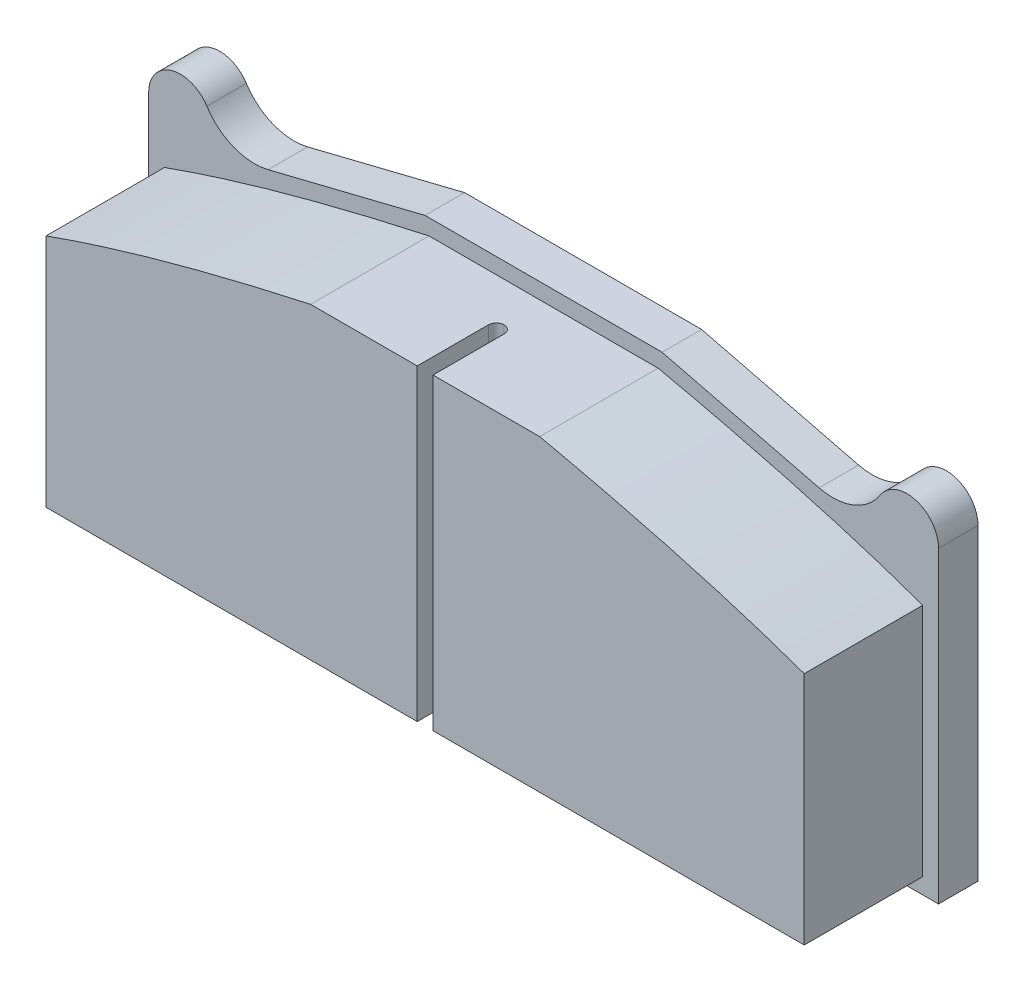
ISO-10303-21;
HEADER;
FILE_DESCRIPTION(('STEP AP214'),'2;1');
FILE_NAME('part.step','',(''),(''),'','','');
FILE_SCHEMA(('AUTOMOTIVE_DESIGN { 1 0 10303 214 1 1 1 1 }'));
ENDSEC;
DATA;
#1=APPLICATION_CONTEXT('core data for automotive mechanical design processes');
#2=APPLICATION_PROTOCOL_DEFINITION('international standard','automotive_design',2000,#1);
#3=PRODUCT_CONTEXT('',#1,'mechanical');
#4=PRODUCT('Part','Part','',(#3));
#5=PRODUCT_RELATED_PRODUCT_CATEGORY('part','',(#4));
#6=PRODUCT_DEFINITION_FORMATION('','',#4);
#7=PRODUCT_DEFINITION_CONTEXT('part definition',#1,'design');
#8=PRODUCT_DEFINITION('design','',#6,#7);
#9=PRODUCT_DEFINITION_SHAPE('','',#8);
#10=(LENGTH_UNIT() NAMED_UNIT(*) SI_UNIT(.MILLI.,.METRE.));
#11=(NAMED_UNIT(*) PLANE_ANGLE_UNIT() SI_UNIT($,.RADIAN.));
#12=(NAMED_UNIT(*) SI_UNIT($,.STERADIAN.) SOLID_ANGLE_UNIT());
#13=UNCERTAINTY_MEASURE_WITH_UNIT(LENGTH_MEASURE(1.E-05),#10,'distance_accuracy_value','');
#14=(GEOMETRIC_REPRESENTATION_CONTEXT(3) GLOBAL_UNCERTAINTY_ASSIGNED_CONTEXT((#13)) GLOBAL_UNIT_ASSIGNED_CONTEXT((#10,
#11,#12)) REPRESENTATION_CONTEXT('',''));
#15=CARTESIAN_POINT('',(0.,0.,0.));
#16=DIRECTION('',(0.,0.,1.));
#17=DIRECTION('',(1.,0.,0.));
#18=AXIS2_PLACEMENT_3D('',#15,#16,#17);
#19=CARTESIAN_POINT('',(-78.3132924028394,-13.4030324169707,20.));
#20=DIRECTION('',(0.,0.,-1.));
#21=DIRECTION('',(-1.,0.,0.));
#22=AXIS2_PLACEMENT_3D('',#19,#20,#21);
#23=PLANE('',#22);
#24=DIRECTION('',(1.,0.,0.));
#25=VECTOR('',#24,1.);
#26=CARTESIAN_POINT('',(48.,-19.5782093478457,20.));
#27=LINE('',#26,#25);
#28=CARTESIAN_POINT('',(-48.,-19.5782093478457,20.));
#29=VERTEX_POINT('',#28);
#30=CARTESIAN_POINT('',(-1.,-19.5782093478457,20.));
#31=VERTEX_POINT('',#30);
#32=EDGE_CURVE('E197',#29,#31,#27,.T.);
#33=ORIENTED_EDGE('',*,*,#32,.T.);
#34=DIRECTION('',(0.,1.,0.));
#35=VECTOR('',#34,1.);
#36=CARTESIAN_POINT('',(-1.,-13.4030324169707,20.));
#37=LINE('',#36,#35);
#38=CARTESIAN_POINT('',(-1.,19.4217906521703,20.));
#39=VERTEX_POINT('',#38);
#40=EDGE_CURVE('E205',#31,#39,#37,.T.);
#41=ORIENTED_EDGE('',*,*,#40,.T.);
#42=DIRECTION('',(-1.,0.,0.));
#43=VECTOR('',#42,1.);
#44=CARTESIAN_POINT('',(-14.5,19.4217906521543,20.));
#45=LINE('',#44,#43);
#46=CARTESIAN_POINT('',(-14.5,19.4217906521543,20.));
#47=VERTEX_POINT('',#46);
#48=EDGE_CURVE('E233',#39,#47,#45,.T.);
#49=ORIENTED_EDGE('',*,*,#48,.T.);
#50=CARTESIAN_POINT('',(995794.494761494,-90910.4584702311,20.));
#51=CARTESIAN_POINT('',(-995472.513073044,95853.1033348043,20.));
#52=CARTESIAN_POINT('',(994837.278214983,-100849.360329045,20.));
#53=B_SPLINE_CURVE_WITH_KNOTS('',2,(#50,#51,#52),.UNSPECIFIED.,.F.,.F.,(3,3),(0.,1.),.UNSPECIFIED.);
#54=CARTESIAN_POINT('',(-48.,10.1761085884526,20.));
#55=VERTEX_POINT('',#54);
#56=EDGE_CURVE('E261',#47,#55,#53,.T.);
#57=ORIENTED_EDGE('',*,*,#56,.T.);
#58=DIRECTION('',(0.,-1.,0.));
#59=VECTOR('',#58,1.);
#60=CARTESIAN_POINT('',(-48.,10.1761085884526,20.));
#61=LINE('',#60,#59);
#62=EDGE_CURVE('E215',#55,#29,#61,.T.);
#63=ORIENTED_EDGE('',*,*,#62,.T.);
#64=EDGE_LOOP('',(#33,#41,#49,#57,#63));
#65=FACE_BOUND('',#64,.T.);
#66=ADVANCED_FACE('F49',(#65),#23,.F.);
#67=DIRECTION('',(0.,0.,-1.));
#68=VECTOR('',#67,1.);
#69=SURFACE_OF_LINEAR_EXTRUSION('',#53,#68);
#70=CARTESIAN_POINT('',(995794.494761494,-90910.4584702311,5.));
#71=CARTESIAN_POINT('',(-995472.513073044,95853.1033348043,5.));
#72=CARTESIAN_POINT('',(994837.278214983,-100849.360329045,5.));
#73=B_SPLINE_CURVE_WITH_KNOTS('',2,(#70,#71,#72),.UNSPECIFIED.,.F.,.F.,(3,3),(0.,1.),.UNSPECIFIED.);
#74=CARTESIAN_POINT('',(-14.5,19.4217906521543,5.));
#75=VERTEX_POINT('',#74);
#76=CARTESIAN_POINT('',(-48.,10.1761085884526,5.));
#77=VERTEX_POINT('',#76);
#78=EDGE_CURVE('E275',#75,#77,#73,.T.);
#79=ORIENTED_EDGE('',*,*,#78,.T.);
#80=DIRECTION('',(0.,0.,-1.));
#81=VECTOR('',#80,1.);
#82=CARTESIAN_POINT('',(-48.,10.1761085884526,20.));
#83=LINE('',#82,#81);
#84=EDGE_CURVE('E212',#55,#77,#83,.T.);
#85=ORIENTED_EDGE('',*,*,#84,.F.);
#86=ORIENTED_EDGE('',*,*,#56,.F.);
#87=DIRECTION('',(0.,0.,-1.));
#88=VECTOR('',#87,1.);
#89=CARTESIAN_POINT('',(-14.5,19.4217906521543,20.));
#90=LINE('',#89,#88);
#91=EDGE_CURVE('E430',#47,#75,#90,.T.);
#92=ORIENTED_EDGE('',*,*,#91,.T.);
#93=EDGE_LOOP('',(#79,#85,#86,#92));
#94=FACE_BOUND('',#93,.T.);
#95=ADVANCED_FACE('F256',(#94),#69,.F.);
#96=CARTESIAN_POINT('',(-48.,10.1761085884526,20.));
#97=DIRECTION('',(1.,0.,0.));
#98=DIRECTION('',(0.,1.,0.));
#99=AXIS2_PLACEMENT_3D('',#96,#97,#98);
#100=PLANE('',#99);
#101=DIRECTION('',(0.,-1.,0.));
#102=VECTOR('',#101,1.);
#103=CARTESIAN_POINT('',(-48.,10.1761085884526,5.));
#104=LINE('',#103,#102);
#105=CARTESIAN_POINT('',(-48.,-19.5782093478457,5.));
#106=VERTEX_POINT('',#105);
#107=EDGE_CURVE('E454',#77,#106,#104,.T.);
#108=ORIENTED_EDGE('',*,*,#107,.T.);
#109=DIRECTION('',(0.,0.,-1.));
#110=VECTOR('',#109,1.);
#111=CARTESIAN_POINT('',(-48.,-19.5782093478457,20.));
#112=LINE('',#111,#110);
#113=EDGE_CURVE('E415',#29,#106,#112,.T.);
#114=ORIENTED_EDGE('',*,*,#113,.F.);
#115=ORIENTED_EDGE('',*,*,#62,.F.);
#116=ORIENTED_EDGE('',*,*,#84,.T.);
#117=EDGE_LOOP('',(#108,#114,#115,#116));
#118=FACE_BOUND('',#117,.T.);
#119=ADVANCED_FACE('F253',(#118),#100,.F.);
#120=CARTESIAN_POINT('',(48.,-19.5782093478457,20.));
#121=DIRECTION('',(0.,1.,0.));
#122=DIRECTION('',(-1.,0.,0.));
#123=AXIS2_PLACEMENT_3D('',#120,#121,#122);
#124=PLANE('',#123);
#125=CARTESIAN_POINT('',(0.,-19.5782093478457,11.));
#126=DIRECTION('',(0.,1.,0.));
#127=DIRECTION('',(-1.,0.,0.));
#128=AXIS2_PLACEMENT_3D('',#125,#126,#127);
#129=CIRCLE('',#128,1.);
#130=CARTESIAN_POINT('',(1.,-19.5782093478457,11.));
#131=VERTEX_POINT('',#130);
#132=CARTESIAN_POINT('',(0.,-19.5782093478457,10.));
#133=VERTEX_POINT('',#132);
#134=EDGE_CURVE('E66',#131,#133,#129,.T.);
#135=ORIENTED_EDGE('',*,*,#134,.T.);
#136=CARTESIAN_POINT('',(0.,-19.5782093478457,11.));
#137=DIRECTION('',(0.,1.,0.));
#138=DIRECTION('',(-1.,0.,0.));
#139=AXIS2_PLACEMENT_3D('',#136,#137,#138);
#140=CIRCLE('',#139,1.);
#141=CARTESIAN_POINT('',(-1.,-19.5782093478457,11.));
#142=VERTEX_POINT('',#141);
#143=EDGE_CURVE('E59',#133,#142,#140,.T.);
#144=ORIENTED_EDGE('',*,*,#143,.T.);
#145=DIRECTION('',(0.,0.,1.));
#146=VECTOR('',#145,1.);
#147=CARTESIAN_POINT('',(-1.,-19.5782093478457,10.));
#148=LINE('',#147,#146);
#149=EDGE_CURVE('E192',#142,#31,#148,.T.);
#150=ORIENTED_EDGE('',*,*,#149,.T.);
#151=ORIENTED_EDGE('',*,*,#32,.F.);
#152=ORIENTED_EDGE('',*,*,#113,.T.);
#153=DIRECTION('',(1.,0.,0.));
#154=VECTOR('',#153,1.);
#155=CARTESIAN_POINT('',(48.,-19.5782093478457,5.));
#156=LINE('',#155,#154);
#157=CARTESIAN_POINT('',(48.,-19.5782093478457,5.));
#158=VERTEX_POINT('',#157);
#159=EDGE_CURVE('E450',#106,#158,#156,.T.);
#160=ORIENTED_EDGE('',*,*,#159,.T.);
#161=DIRECTION('',(0.,0.,-1.));
#162=VECTOR('',#161,1.);
#163=CARTESIAN_POINT('',(48.,-19.5782093478457,20.));
#164=LINE('',#163,#162);
#165=CARTESIAN_POINT('',(48.,-19.5782093478457,20.));
#166=VERTEX_POINT('',#165);
#167=EDGE_CURVE('E418',#166,#158,#164,.T.);
#168=ORIENTED_EDGE('',*,*,#167,.F.);
#169=CARTESIAN_POINT('',(1.,-19.5782093478457,20.));
#170=VERTEX_POINT('',#169);
#171=EDGE_CURVE('E219',#170,#166,#27,.T.);
#172=ORIENTED_EDGE('',*,*,#171,.F.);
#173=DIRECTION('',(0.,0.,1.));
#174=VECTOR('',#173,1.);
#175=CARTESIAN_POINT('',(1.,-19.5782093478457,10.));
#176=LINE('',#175,#174);
#177=EDGE_CURVE('E201',#131,#170,#176,.T.);
#178=ORIENTED_EDGE('',*,*,#177,.F.);
#179=EDGE_LOOP('',(#135,#144,#150,#151,#152,#160,#168,#172,#178));
#180=FACE_BOUND('',#179,.T.);
#181=ADVANCED_FACE('F194',(#180),#124,.F.);
#182=CARTESIAN_POINT('',(48.,10.1761085884526,20.));
#183=DIRECTION('',(-1.,0.,0.));
#184=DIRECTION('',(0.,-1.,0.));
#185=AXIS2_PLACEMENT_3D('',#182,#183,#184);
#186=PLANE('',#185);
#187=DIRECTION('',(0.,1.,0.));
#188=VECTOR('',#187,1.);
#189=CARTESIAN_POINT('',(48.,10.1761085884526,5.));
#190=LINE('',#189,#188);
#191=CARTESIAN_POINT('',(48.000000060374,10.1761085667351,5.));
#192=VERTEX_POINT('',#191);
#193=EDGE_CURVE('E443',#158,#192,#190,.T.);
#194=ORIENTED_EDGE('',*,*,#193,.T.);
#195=DIRECTION('',(0.,0.,-1.));
#196=VECTOR('',#195,1.);
#197=CARTESIAN_POINT('',(48.000000060374,10.1761085667351,20.));
#198=LINE('',#197,#196);
#199=CARTESIAN_POINT('',(48.000000060374,10.1761085667351,20.));
#200=VERTEX_POINT('',#199);
#201=EDGE_CURVE('E422',#200,#192,#198,.T.);
#202=ORIENTED_EDGE('',*,*,#201,.F.);
#203=DIRECTION('',(0.,1.,0.));
#204=VECTOR('',#203,1.);
#205=CARTESIAN_POINT('',(48.,10.1761085884526,20.));
#206=LINE('',#205,#204);
#207=EDGE_CURVE('E218',#166,#200,#206,.T.);
#208=ORIENTED_EDGE('',*,*,#207,.F.);
#209=ORIENTED_EDGE('',*,*,#167,.T.);
#210=EDGE_LOOP('',(#194,#202,#208,#209));
#211=FACE_BOUND('',#210,.T.);
#212=ADVANCED_FACE('F245',(#211),#186,.F.);
#213=CARTESIAN_POINT('',(-994837.278214983,-100849.360329045,20.));
#214=CARTESIAN_POINT('',(995472.513073044,95853.1033348043,20.));
#215=CARTESIAN_POINT('',(-995794.494761494,-90910.4584702311,20.));
#216=B_SPLINE_CURVE_WITH_KNOTS('',2,(#213,#214,#215),.UNSPECIFIED.,.F.,.F.,(3,3),(0.,1.),.UNSPECIFIED.);
#217=DIRECTION('',(0.,0.,-1.));
#218=VECTOR('',#217,1.);
#219=SURFACE_OF_LINEAR_EXTRUSION('',#216,#218);
#220=CARTESIAN_POINT('',(-994837.278214983,-100849.360329045,5.));
#221=CARTESIAN_POINT('',(995472.513073044,95853.1033348043,5.));
#222=CARTESIAN_POINT('',(-995794.494761494,-90910.4584702311,5.));
#223=B_SPLINE_CURVE_WITH_KNOTS('',2,(#220,#221,#222),.UNSPECIFIED.,.F.,.F.,(3,3),(0.,1.),.UNSPECIFIED.);
#224=CARTESIAN_POINT('',(14.5,19.4217906521543,5.));
#225=VERTEX_POINT('',#224);
#226=EDGE_CURVE('E437',#192,#225,#223,.T.);
#227=ORIENTED_EDGE('',*,*,#226,.T.);
#228=DIRECTION('',(0.,0.,-1.));
#229=VECTOR('',#228,1.);
#230=CARTESIAN_POINT('',(14.5,19.4217906521543,20.));
#231=LINE('',#230,#229);
#232=CARTESIAN_POINT('',(14.5,19.4217906521543,20.));
#233=VERTEX_POINT('',#232);
#234=EDGE_CURVE('E426',#233,#225,#231,.T.);
#235=ORIENTED_EDGE('',*,*,#234,.F.);
#236=EDGE_CURVE('E223',#200,#233,#216,.T.);
#237=ORIENTED_EDGE('',*,*,#236,.F.);
#238=ORIENTED_EDGE('',*,*,#201,.T.);
#239=EDGE_LOOP('',(#227,#235,#237,#238));
#240=FACE_BOUND('',#239,.T.);
#241=ADVANCED_FACE('F240',(#240),#219,.F.);
#242=CARTESIAN_POINT('',(-14.5,19.4217906521543,20.));
#243=DIRECTION('',(0.,-1.,0.));
#244=DIRECTION('',(0.,0.,-1.));
#245=AXIS2_PLACEMENT_3D('',#242,#243,#244);
#246=PLANE('',#245);
#247=ORIENTED_EDGE('',*,*,#48,.F.);
#248=DIRECTION('',(0.,0.,-1.));
#249=VECTOR('',#248,1.);
#250=CARTESIAN_POINT('',(-1.,19.4217906521543,20.));
#251=LINE('',#250,#249);
#252=CARTESIAN_POINT('',(-1.,19.4217906521543,11.));
#253=VERTEX_POINT('',#252);
#254=EDGE_CURVE('E207',#39,#253,#251,.T.);
#255=ORIENTED_EDGE('',*,*,#254,.T.);
#256=CARTESIAN_POINT('',(0.,19.4217906521543,11.));
#257=DIRECTION('',(0.,-1.,0.));
#258=DIRECTION('',(0.,0.,-1.));
#259=AXIS2_PLACEMENT_3D('',#256,#257,#258);
#260=CIRCLE('',#259,1.);
#261=CARTESIAN_POINT('',(0.,19.4217906521543,10.));
#262=VERTEX_POINT('',#261);
#263=EDGE_CURVE('E11',#253,#262,#260,.T.);
#264=ORIENTED_EDGE('',*,*,#263,.T.);
#265=CARTESIAN_POINT('',(0.,19.4217906521543,11.));
#266=DIRECTION('',(0.,-1.,0.));
#267=DIRECTION('',(0.,0.,-1.));
#268=AXIS2_PLACEMENT_3D('',#265,#266,#267);
#269=CIRCLE('',#268,1.);
#270=CARTESIAN_POINT('',(1.,19.4217906521543,11.));
#271=VERTEX_POINT('',#270);
#272=EDGE_CURVE('E398',#262,#271,#269,.T.);
#273=ORIENTED_EDGE('',*,*,#272,.T.);
#274=DIRECTION('',(0.,0.,1.));
#275=VECTOR('',#274,1.);
#276=CARTESIAN_POINT('',(1.,19.4217906521543,20.));
#277=LINE('',#276,#275);
#278=CARTESIAN_POINT('',(1.,19.4217906521703,20.));
#279=VERTEX_POINT('',#278);
#280=EDGE_CURVE('E381',#271,#279,#277,.T.);
#281=ORIENTED_EDGE('',*,*,#280,.T.);
#282=EDGE_CURVE('E234',#233,#279,#45,.T.);
#283=ORIENTED_EDGE('',*,*,#282,.F.);
#284=ORIENTED_EDGE('',*,*,#234,.T.);
#285=DIRECTION('',(-1.,0.,0.));
#286=VECTOR('',#285,1.);
#287=CARTESIAN_POINT('',(-14.5,19.4217906521543,5.));
#288=LINE('',#287,#286);
#289=EDGE_CURVE('E267',#225,#75,#288,.T.);
#290=ORIENTED_EDGE('',*,*,#289,.T.);
#291=ORIENTED_EDGE('',*,*,#91,.F.);
#292=EDGE_LOOP('',(#247,#255,#264,#273,#281,#283,#284,#290,#291));
#293=FACE_BOUND('',#292,.T.);
#294=ADVANCED_FACE('F244',(#293),#246,.F.);
#295=ORIENTED_EDGE('',*,*,#282,.T.);
#296=DIRECTION('',(0.,1.,0.));
#297=VECTOR('',#296,1.);
#298=CARTESIAN_POINT('',(1.,19.5782093478457,20.));
#299=LINE('',#298,#297);
#300=EDGE_CURVE('E202',#170,#279,#299,.T.);
#301=ORIENTED_EDGE('',*,*,#300,.F.);
#302=ORIENTED_EDGE('',*,*,#171,.T.);
#303=ORIENTED_EDGE('',*,*,#207,.T.);
#304=ORIENTED_EDGE('',*,*,#236,.T.);
#305=EDGE_LOOP('',(#295,#301,#302,#303,#304));
#306=FACE_BOUND('',#305,.T.);
#307=ADVANCED_FACE('F480',(#306),#23,.F.);
#308=CARTESIAN_POINT('',(0.,0.,5.));
#309=DIRECTION('',(0.,0.,1.));
#310=DIRECTION('',(1.,0.,0.));
#311=AXIS2_PLACEMENT_3D('',#308,#309,#310);
#312=PLANE('',#311);
#313=DIRECTION('',(-0.970668500042017,-0.24042184390396,0.));
#314=VECTOR('',#313,1.);
#315=CARTESIAN_POINT('',(-5.86624131476915,23.6841027646643,5.));
#316=LINE('',#315,#314);
#317=CARTESIAN_POINT('',(-15.,21.4217906521543,5.));
#318=VERTEX_POINT('',#317);
#319=CARTESIAN_POINT('',(-34.8874626318449,16.4959272535663,5.));
#320=VERTEX_POINT('',#319);
#321=EDGE_CURVE('E308',#318,#320,#316,.T.);
#322=ORIENTED_EDGE('',*,*,#321,.T.);
#323=CARTESIAN_POINT('',(-36.6078911726818,23.4419092161318,5.));
#324=DIRECTION('',(0.,0.,1.));
#325=DIRECTION('',(1.,0.,0.));
#326=AXIS2_PLACEMENT_3D('',#323,#324,#325);
#327=CIRCLE('',#326,7.1558744950154);
#328=CARTESIAN_POINT('',(-42.6324078559634,19.5803371889291,5.));
#329=VERTEX_POINT('',#328);
#330=EDGE_CURVE('E373',#320,#329,#327,.F.);
#331=ORIENTED_EDGE('',*,*,#330,.T.);
#332=CARTESIAN_POINT('',(-46.,17.4217906521543,5.));
#333=DIRECTION('',(0.,0.,1.));
#334=DIRECTION('',(1.,0.,0.));
#335=AXIS2_PLACEMENT_3D('',#332,#333,#334);
#336=CIRCLE('',#335,3.99999999999999);
#337=CARTESIAN_POINT('',(-50.,17.4217906521543,5.));
#338=VERTEX_POINT('',#337);
#339=EDGE_CURVE('E369',#338,#329,#336,.F.);
#340=ORIENTED_EDGE('',*,*,#339,.F.);
#341=DIRECTION('',(0.,-1.,0.));
#342=VECTOR('',#341,1.);
#343=CARTESIAN_POINT('',(-50.,0.,5.));
#344=LINE('',#343,#342);
#345=CARTESIAN_POINT('',(-50.,-21.5782093478457,5.));
#346=VERTEX_POINT('',#345);
#347=EDGE_CURVE('E366',#338,#346,#344,.T.);
#348=ORIENTED_EDGE('',*,*,#347,.T.);
#349=DIRECTION('',(-1.,0.,0.));
#350=VECTOR('',#349,1.);
#351=CARTESIAN_POINT('',(0.,-21.5782093478457,5.));
#352=LINE('',#351,#350);
#353=CARTESIAN_POINT('',(50.,-21.5782093478457,5.));
#354=VERTEX_POINT('',#353);
#355=EDGE_CURVE('E362',#354,#346,#352,.T.);
#356=ORIENTED_EDGE('',*,*,#355,.F.);
#357=DIRECTION('',(0.,-1.,0.));
#358=VECTOR('',#357,1.);
#359=CARTESIAN_POINT('',(50.,0.,5.));
#360=LINE('',#359,#358);
#361=CARTESIAN_POINT('',(50.,17.4217906521543,5.));
#362=VERTEX_POINT('',#361);
#363=EDGE_CURVE('E358',#362,#354,#360,.T.);
#364=ORIENTED_EDGE('',*,*,#363,.F.);
#365=CARTESIAN_POINT('',(46.,17.4217906521543,5.));
#366=DIRECTION('',(0.,0.,1.));
#367=DIRECTION('',(1.,0.,0.));
#368=AXIS2_PLACEMENT_3D('',#365,#366,#367);
#369=CIRCLE('',#368,3.99999999999999);
#370=CARTESIAN_POINT('',(42.6324078559634,19.5803371889291,5.));
#371=VERTEX_POINT('',#370);
#372=EDGE_CURVE('E355',#362,#371,#369,.T.);
#373=ORIENTED_EDGE('',*,*,#372,.T.);
#374=CARTESIAN_POINT('',(36.6078911726818,23.4419092161319,5.));
#375=DIRECTION('',(0.,0.,1.));
#376=DIRECTION('',(1.,0.,0.));
#377=AXIS2_PLACEMENT_3D('',#374,#375,#376);
#378=CIRCLE('',#377,7.15587449501541);
#379=CARTESIAN_POINT('',(34.8874626318449,16.4959272535663,5.));
#380=VERTEX_POINT('',#379);
#381=EDGE_CURVE('E351',#380,#371,#378,.T.);
#382=ORIENTED_EDGE('',*,*,#381,.F.);
#383=DIRECTION('',(0.970668500042018,-0.24042184390396,0.));
#384=VECTOR('',#383,1.);
#385=CARTESIAN_POINT('',(5.86624131476914,23.6841027646643,5.));
#386=LINE('',#385,#384);
#387=CARTESIAN_POINT('',(15.,21.4217906521543,5.));
#388=VERTEX_POINT('',#387);
#389=EDGE_CURVE('E347',#388,#380,#386,.T.);
#390=ORIENTED_EDGE('',*,*,#389,.F.);
#391=DIRECTION('',(-1.,0.,0.));
#392=VECTOR('',#391,1.);
#393=CARTESIAN_POINT('',(0.,21.4217906521543,5.));
#394=LINE('',#393,#392);
#395=EDGE_CURVE('E304',#388,#318,#394,.T.);
#396=ORIENTED_EDGE('',*,*,#395,.T.);
#397=EDGE_LOOP('',(#322,#331,#340,#348,#356,#364,#373,#382,#390,#396));
#398=FACE_BOUND('',#397,.T.);
#399=ORIENTED_EDGE('',*,*,#78,.F.);
#400=ORIENTED_EDGE('',*,*,#289,.F.);
#401=ORIENTED_EDGE('',*,*,#226,.F.);
#402=ORIENTED_EDGE('',*,*,#193,.F.);
#403=ORIENTED_EDGE('',*,*,#159,.F.);
#404=ORIENTED_EDGE('',*,*,#107,.F.);
#405=EDGE_LOOP('',(#399,#400,#401,#402,#403,#404));
#406=FACE_BOUND('',#405,.T.);
#407=ADVANCED_FACE('F468',(#398,#406),#312,.T.);
#408=CARTESIAN_POINT('',(-5.86624131476915,23.6841027646643,5.));
#409=DIRECTION('',(0.24042184390396,-0.970668500042017,0.));
#410=DIRECTION('',(0.970668500042017,0.24042184390396,0.));
#411=AXIS2_PLACEMENT_3D('',#408,#409,#410);
#412=PLANE('',#411);
#413=DIRECTION('',(-0.970668500042017,-0.24042184390396,0.));
#414=VECTOR('',#413,1.);
#415=CARTESIAN_POINT('',(-5.86624131476915,23.6841027646643,0.));
#416=LINE('',#415,#414);
#417=CARTESIAN_POINT('',(-15.,21.4217906521543,0.));
#418=VERTEX_POINT('',#417);
#419=CARTESIAN_POINT('',(-34.8874626318449,16.4959272535663,0.));
#420=VERTEX_POINT('',#419);
#421=EDGE_CURVE('E341',#418,#420,#416,.T.);
#422=ORIENTED_EDGE('',*,*,#421,.T.);
#423=DIRECTION('',(0.,0.,-1.));
#424=VECTOR('',#423,1.);
#425=CARTESIAN_POINT('',(-34.8874626318449,16.4959272535663,5.));
#426=LINE('',#425,#424);
#427=EDGE_CURVE('E268',#320,#420,#426,.T.);
#428=ORIENTED_EDGE('',*,*,#427,.F.);
#429=ORIENTED_EDGE('',*,*,#321,.F.);
#430=DIRECTION('',(0.,0.,-1.));
#431=VECTOR('',#430,1.);
#432=CARTESIAN_POINT('',(-15.,21.4217906521543,5.));
#433=LINE('',#432,#431);
#434=EDGE_CURVE('E300',#318,#418,#433,.T.);
#435=ORIENTED_EDGE('',*,*,#434,.T.);
#436=EDGE_LOOP('',(#422,#428,#429,#435));
#437=FACE_BOUND('',#436,.T.);
#438=ADVANCED_FACE('F486',(#437),#412,.F.);
#439=CARTESIAN_POINT('',(-36.6078911726818,23.4419092161318,5.));
#440=DIRECTION('',(0.,0.,-1.));
#441=DIRECTION('',(-1.,0.,0.));
#442=AXIS2_PLACEMENT_3D('',#439,#440,#441);
#443=CYLINDRICAL_SURFACE('',#442,7.1558744950154);
#444=CARTESIAN_POINT('',(-36.6078911726818,23.4419092161318,0.));
#445=DIRECTION('',(0.,0.,1.));
#446=DIRECTION('',(1.,0.,0.));
#447=AXIS2_PLACEMENT_3D('',#444,#445,#446);
#448=CIRCLE('',#447,7.1558744950154);
#449=CARTESIAN_POINT('',(-42.6324078559634,19.5803371889291,0.));
#450=VERTEX_POINT('',#449);
#451=EDGE_CURVE('E337',#420,#450,#448,.F.);
#452=ORIENTED_EDGE('',*,*,#451,.T.);
#453=DIRECTION('',(0.,0.,-1.));
#454=VECTOR('',#453,1.);
#455=CARTESIAN_POINT('',(-42.6324078559634,19.5803371889291,5.));
#456=LINE('',#455,#454);
#457=EDGE_CURVE('E276',#329,#450,#456,.T.);
#458=ORIENTED_EDGE('',*,*,#457,.F.);
#459=ORIENTED_EDGE('',*,*,#330,.F.);
#460=ORIENTED_EDGE('',*,*,#427,.T.);
#461=EDGE_LOOP('',(#452,#458,#459,#460));
#462=FACE_BOUND('',#461,.T.);
#463=ADVANCED_FACE('F573',(#462),#443,.F.);
#464=CARTESIAN_POINT('',(-46.,17.4217906521543,5.));
#465=DIRECTION('',(0.,0.,-1.));
#466=DIRECTION('',(-1.,0.,0.));
#467=AXIS2_PLACEMENT_3D('',#464,#465,#466);
#468=CYLINDRICAL_SURFACE('',#467,3.99999999999999);
#469=CARTESIAN_POINT('',(-46.,17.4217906521543,0.));
#470=DIRECTION('',(0.,0.,1.));
#471=DIRECTION('',(1.,0.,0.));
#472=AXIS2_PLACEMENT_3D('',#469,#470,#471);
#473=CIRCLE('',#472,3.99999999999999);
#474=CARTESIAN_POINT('',(-50.,17.4217906521543,0.));
#475=VERTEX_POINT('',#474);
#476=EDGE_CURVE('E333',#475,#450,#473,.F.);
#477=ORIENTED_EDGE('',*,*,#476,.F.);
#478=DIRECTION('',(0.,0.,-1.));
#479=VECTOR('',#478,1.);
#480=CARTESIAN_POINT('',(-50.,17.4217906521543,5.));
#481=LINE('',#480,#479);
#482=EDGE_CURVE('E279',#338,#475,#481,.T.);
#483=ORIENTED_EDGE('',*,*,#482,.F.);
#484=ORIENTED_EDGE('',*,*,#339,.T.);
#485=ORIENTED_EDGE('',*,*,#457,.T.);
#486=EDGE_LOOP('',(#477,#483,#484,#485));
#487=FACE_BOUND('',#486,.T.);
#488=ADVANCED_FACE('F564',(#487),#468,.T.);
#489=CARTESIAN_POINT('',(-50.,0.,5.));
#490=DIRECTION('',(1.,0.,0.));
#491=DIRECTION('',(0.,1.,0.));
#492=AXIS2_PLACEMENT_3D('',#489,#490,#491);
#493=PLANE('',#492);
#494=DIRECTION('',(0.,-1.,0.));
#495=VECTOR('',#494,1.);
#496=CARTESIAN_POINT('',(-50.,0.,0.));
#497=LINE('',#496,#495);
#498=CARTESIAN_POINT('',(-50.,-21.5782093478457,0.));
#499=VERTEX_POINT('',#498);
#500=EDGE_CURVE('E329',#475,#499,#497,.T.);
#501=ORIENTED_EDGE('',*,*,#500,.T.);
#502=DIRECTION('',(0.,0.,-1.));
#503=VECTOR('',#502,1.);
#504=CARTESIAN_POINT('',(-50.,-21.5782093478457,5.));
#505=LINE('',#504,#503);
#506=EDGE_CURVE('E282',#346,#499,#505,.T.);
#507=ORIENTED_EDGE('',*,*,#506,.F.);
#508=ORIENTED_EDGE('',*,*,#347,.F.);
#509=ORIENTED_EDGE('',*,*,#482,.T.);
#510=EDGE_LOOP('',(#501,#507,#508,#509));
#511=FACE_BOUND('',#510,.T.);
#512=ADVANCED_FACE('F555',(#511),#493,.F.);
#513=CARTESIAN_POINT('',(0.,-21.5782093478457,5.));
#514=DIRECTION('',(0.,-1.,0.));
#515=DIRECTION('',(1.,0.,0.));
#516=AXIS2_PLACEMENT_3D('',#513,#514,#515);
#517=PLANE('',#516);
#518=DIRECTION('',(-1.,0.,0.));
#519=VECTOR('',#518,1.);
#520=CARTESIAN_POINT('',(0.,-21.5782093478457,0.));
#521=LINE('',#520,#519);
#522=CARTESIAN_POINT('',(50.,-21.5782093478457,0.));
#523=VERTEX_POINT('',#522);
#524=EDGE_CURVE('E325',#523,#499,#521,.T.);
#525=ORIENTED_EDGE('',*,*,#524,.F.);
#526=DIRECTION('',(0.,0.,-1.));
#527=VECTOR('',#526,1.);
#528=CARTESIAN_POINT('',(50.,-21.5782093478457,5.));
#529=LINE('',#528,#527);
#530=EDGE_CURVE('E285',#354,#523,#529,.T.);
#531=ORIENTED_EDGE('',*,*,#530,.F.);
#532=ORIENTED_EDGE('',*,*,#355,.T.);
#533=ORIENTED_EDGE('',*,*,#506,.T.);
#534=EDGE_LOOP('',(#525,#531,#532,#533));
#535=FACE_BOUND('',#534,.T.);
#536=ADVANCED_FACE('F546',(#535),#517,.T.);
#537=CARTESIAN_POINT('',(50.,0.,5.));
#538=DIRECTION('',(1.,0.,0.));
#539=DIRECTION('',(0.,1.,0.));
#540=AXIS2_PLACEMENT_3D('',#537,#538,#539);
#541=PLANE('',#540);
#542=DIRECTION('',(0.,-1.,0.));
#543=VECTOR('',#542,1.);
#544=CARTESIAN_POINT('',(50.,0.,0.));
#545=LINE('',#544,#543);
#546=CARTESIAN_POINT('',(50.,17.4217906521543,0.));
#547=VERTEX_POINT('',#546);
#548=EDGE_CURVE('E321',#547,#523,#545,.T.);
#549=ORIENTED_EDGE('',*,*,#548,.F.);
#550=DIRECTION('',(0.,0.,-1.));
#551=VECTOR('',#550,1.);
#552=CARTESIAN_POINT('',(50.,17.4217906521543,5.));
#553=LINE('',#552,#551);
#554=EDGE_CURVE('E288',#362,#547,#553,.T.);
#555=ORIENTED_EDGE('',*,*,#554,.F.);
#556=ORIENTED_EDGE('',*,*,#363,.T.);
#557=ORIENTED_EDGE('',*,*,#530,.T.);
#558=EDGE_LOOP('',(#549,#555,#556,#557));
#559=FACE_BOUND('',#558,.T.);
#560=ADVANCED_FACE('F537',(#559),#541,.T.);
#561=CARTESIAN_POINT('',(46.,17.4217906521543,5.));
#562=DIRECTION('',(0.,0.,-1.));
#563=DIRECTION('',(-1.,0.,0.));
#564=AXIS2_PLACEMENT_3D('',#561,#562,#563);
#565=CYLINDRICAL_SURFACE('',#564,3.99999999999999);
#566=CARTESIAN_POINT('',(46.,17.4217906521543,0.));
#567=DIRECTION('',(0.,0.,1.));
#568=DIRECTION('',(1.,0.,0.));
#569=AXIS2_PLACEMENT_3D('',#566,#567,#568);
#570=CIRCLE('',#569,3.99999999999999);
#571=CARTESIAN_POINT('',(42.6324078559634,19.5803371889291,0.));
#572=VERTEX_POINT('',#571);
#573=EDGE_CURVE('E317',#547,#572,#570,.T.);
#574=ORIENTED_EDGE('',*,*,#573,.T.);
#575=DIRECTION('',(0.,0.,-1.));
#576=VECTOR('',#575,1.);
#577=CARTESIAN_POINT('',(42.6324078559634,19.5803371889291,5.));
#578=LINE('',#577,#576);
#579=EDGE_CURVE('E291',#371,#572,#578,.T.);
#580=ORIENTED_EDGE('',*,*,#579,.F.);
#581=ORIENTED_EDGE('',*,*,#372,.F.);
#582=ORIENTED_EDGE('',*,*,#554,.T.);
#583=EDGE_LOOP('',(#574,#580,#581,#582));
#584=FACE_BOUND('',#583,.T.);
#585=ADVANCED_FACE('F528',(#584),#565,.T.);
#586=CARTESIAN_POINT('',(36.6078911726818,23.4419092161319,5.));
#587=DIRECTION('',(0.,0.,-1.));
#588=DIRECTION('',(-1.,0.,0.));
#589=AXIS2_PLACEMENT_3D('',#586,#587,#588);
#590=CYLINDRICAL_SURFACE('',#589,7.15587449501541);
#591=CARTESIAN_POINT('',(36.6078911726818,23.4419092161319,0.));
#592=DIRECTION('',(0.,0.,1.));
#593=DIRECTION('',(1.,0.,0.));
#594=AXIS2_PLACEMENT_3D('',#591,#592,#593);
#595=CIRCLE('',#594,7.15587449501541);
#596=CARTESIAN_POINT('',(34.8874626318449,16.4959272535663,0.));
#597=VERTEX_POINT('',#596);
#598=EDGE_CURVE('E313',#597,#572,#595,.T.);
#599=ORIENTED_EDGE('',*,*,#598,.F.);
#600=DIRECTION('',(0.,0.,-1.));
#601=VECTOR('',#600,1.);
#602=CARTESIAN_POINT('',(34.8874626318449,16.4959272535663,5.));
#603=LINE('',#602,#601);
#604=EDGE_CURVE('E294',#380,#597,#603,.T.);
#605=ORIENTED_EDGE('',*,*,#604,.F.);
#606=ORIENTED_EDGE('',*,*,#381,.T.);
#607=ORIENTED_EDGE('',*,*,#579,.T.);
#608=EDGE_LOOP('',(#599,#605,#606,#607));
#609=FACE_BOUND('',#608,.T.);
#610=ADVANCED_FACE('F519',(#609),#590,.F.);
#611=CARTESIAN_POINT('',(5.86624131476914,23.6841027646643,5.));
#612=DIRECTION('',(0.24042184390396,0.970668500042017,0.));
#613=DIRECTION('',(-0.970668500042017,0.24042184390396,0.));
#614=AXIS2_PLACEMENT_3D('',#611,#612,#613);
#615=PLANE('',#614);
#616=DIRECTION('',(0.970668500042018,-0.24042184390396,0.));
#617=VECTOR('',#616,1.);
#618=CARTESIAN_POINT('',(5.86624131476914,23.6841027646643,0.));
#619=LINE('',#618,#617);
#620=CARTESIAN_POINT('',(15.,21.4217906521543,0.));
#621=VERTEX_POINT('',#620);
#622=EDGE_CURVE('E309',#621,#597,#619,.T.);
#623=ORIENTED_EDGE('',*,*,#622,.F.);
#624=DIRECTION('',(0.,0.,-1.));
#625=VECTOR('',#624,1.);
#626=CARTESIAN_POINT('',(15.,21.4217906521543,5.));
#627=LINE('',#626,#625);
#628=EDGE_CURVE('E297',#388,#621,#627,.T.);
#629=ORIENTED_EDGE('',*,*,#628,.F.);
#630=ORIENTED_EDGE('',*,*,#389,.T.);
#631=ORIENTED_EDGE('',*,*,#604,.T.);
#632=EDGE_LOOP('',(#623,#629,#630,#631));
#633=FACE_BOUND('',#632,.T.);
#634=ADVANCED_FACE('F510',(#633),#615,.T.);
#635=CARTESIAN_POINT('',(0.,21.4217906521543,5.));
#636=DIRECTION('',(0.,-1.,0.));
#637=DIRECTION('',(1.,0.,0.));
#638=AXIS2_PLACEMENT_3D('',#635,#636,#637);
#639=PLANE('',#638);
#640=DIRECTION('',(-1.,0.,0.));
#641=VECTOR('',#640,1.);
#642=CARTESIAN_POINT('',(0.,21.4217906521543,0.));
#643=LINE('',#642,#641);
#644=EDGE_CURVE('E305',#621,#418,#643,.T.);
#645=ORIENTED_EDGE('',*,*,#644,.T.);
#646=ORIENTED_EDGE('',*,*,#434,.F.);
#647=ORIENTED_EDGE('',*,*,#395,.F.);
#648=ORIENTED_EDGE('',*,*,#628,.T.);
#649=EDGE_LOOP('',(#645,#646,#647,#648));
#650=FACE_BOUND('',#649,.T.);
#651=ADVANCED_FACE('F502',(#650),#639,.F.);
#652=CARTESIAN_POINT('',(0.,0.,0.));
#653=DIRECTION('',(0.,0.,1.));
#654=DIRECTION('',(1.,0.,0.));
#655=AXIS2_PLACEMENT_3D('',#652,#653,#654);
#656=PLANE('',#655);
#657=ORIENTED_EDGE('',*,*,#421,.F.);
#658=ORIENTED_EDGE('',*,*,#644,.F.);
#659=ORIENTED_EDGE('',*,*,#622,.T.);
#660=ORIENTED_EDGE('',*,*,#598,.T.);
#661=ORIENTED_EDGE('',*,*,#573,.F.);
#662=ORIENTED_EDGE('',*,*,#548,.T.);
#663=ORIENTED_EDGE('',*,*,#524,.T.);
#664=ORIENTED_EDGE('',*,*,#500,.F.);
#665=ORIENTED_EDGE('',*,*,#476,.T.);
#666=ORIENTED_EDGE('',*,*,#451,.F.);
#667=EDGE_LOOP('',(#657,#658,#659,#660,#661,#662,#663,#664,#665,#666));
#668=FACE_BOUND('',#667,.T.);
#669=ADVANCED_FACE('F498',(#668),#656,.F.);
#670=CARTESIAN_POINT('',(-1.,19.5782093478457,10.));
#671=DIRECTION('',(-1.,0.,0.));
#672=DIRECTION('',(0.,0.,1.));
#673=AXIS2_PLACEMENT_3D('',#670,#671,#672);
#674=PLANE('',#673);
#675=ORIENTED_EDGE('',*,*,#149,.F.);
#676=DIRECTION('',(0.,-1.,0.));
#677=VECTOR('',#676,1.);
#678=CARTESIAN_POINT('',(-1.,19.4217906521543,11.));
#679=LINE('',#678,#677);
#680=EDGE_CURVE('E400',#142,#253,#679,.F.);
#681=ORIENTED_EDGE('',*,*,#680,.T.);
#682=ORIENTED_EDGE('',*,*,#254,.F.);
#683=ORIENTED_EDGE('',*,*,#40,.F.);
#684=EDGE_LOOP('',(#675,#681,#682,#683));
#685=FACE_BOUND('',#684,.T.);
#686=ADVANCED_FACE('F206',(#685),#674,.F.);
#687=CARTESIAN_POINT('',(1.,19.5782093478457,10.));
#688=DIRECTION('',(1.,0.,0.));
#689=DIRECTION('',(0.,0.,-1.));
#690=AXIS2_PLACEMENT_3D('',#687,#688,#689);
#691=PLANE('',#690);
#692=ORIENTED_EDGE('',*,*,#280,.F.);
#693=DIRECTION('',(0.,1.,0.));
#694=VECTOR('',#693,1.);
#695=CARTESIAN_POINT('',(1.,-19.5782093478457,11.));
#696=LINE('',#695,#694);
#697=EDGE_CURVE('E211',#271,#131,#696,.F.);
#698=ORIENTED_EDGE('',*,*,#697,.T.);
#699=ORIENTED_EDGE('',*,*,#177,.T.);
#700=ORIENTED_EDGE('',*,*,#300,.T.);
#701=EDGE_LOOP('',(#692,#698,#699,#700));
#702=FACE_BOUND('',#701,.T.);
#703=ADVANCED_FACE('F654',(#702),#691,.F.);
#704=CARTESIAN_POINT('',(0.,0.,11.));
#705=DIRECTION('',(0.,1.,0.));
#706=DIRECTION('',(0.,0.,1.));
#707=AXIS2_PLACEMENT_3D('',#704,#705,#706);
#708=CYLINDRICAL_SURFACE('',#707,1.);
#709=ORIENTED_EDGE('',*,*,#680,.F.);
#710=ORIENTED_EDGE('',*,*,#143,.F.);
#711=DIRECTION('',(0.,-1.,0.));
#712=VECTOR('',#711,1.);
#713=CARTESIAN_POINT('',(0.,-19.5782093478457,10.));
#714=LINE('',#713,#712);
#715=EDGE_CURVE('E53',#262,#133,#714,.T.);
#716=ORIENTED_EDGE('',*,*,#715,.F.);
#717=ORIENTED_EDGE('',*,*,#263,.F.);
#718=EDGE_LOOP('',(#709,#710,#716,#717));
#719=FACE_BOUND('',#718,.T.);
#720=ADVANCED_FACE('F51',(#719),#708,.F.);
#721=CARTESIAN_POINT('',(0.,0.,11.));
#722=DIRECTION('',(0.,-1.,0.));
#723=DIRECTION('',(0.,0.,-1.));
#724=AXIS2_PLACEMENT_3D('',#721,#722,#723);
#725=CYLINDRICAL_SURFACE('',#724,1.);
#726=ORIENTED_EDGE('',*,*,#134,.F.);
#727=ORIENTED_EDGE('',*,*,#697,.F.);
#728=ORIENTED_EDGE('',*,*,#272,.F.);
#729=ORIENTED_EDGE('',*,*,#715,.T.);
#730=EDGE_LOOP('',(#726,#727,#728,#729));
#731=FACE_BOUND('',#730,.T.);
#732=ADVANCED_FACE('F260',(#731),#725,.F.);
#733=CLOSED_SHELL('',(#66,#95,#119,#181,#212,#241,#294,#307,#407,#438,#463,#488,#512,#536,#560,
#585,#610,#634,#651,#669,#686,#703,#720,#732));
#734=MANIFOLD_SOLID_BREP('B2',#733);
#735=ADVANCED_BREP_SHAPE_REPRESENTATION('',(#18,#734),#14);
#736=SHAPE_DEFINITION_REPRESENTATION(#9,#735);
ENDSEC;
END-ISO-10303-21;
